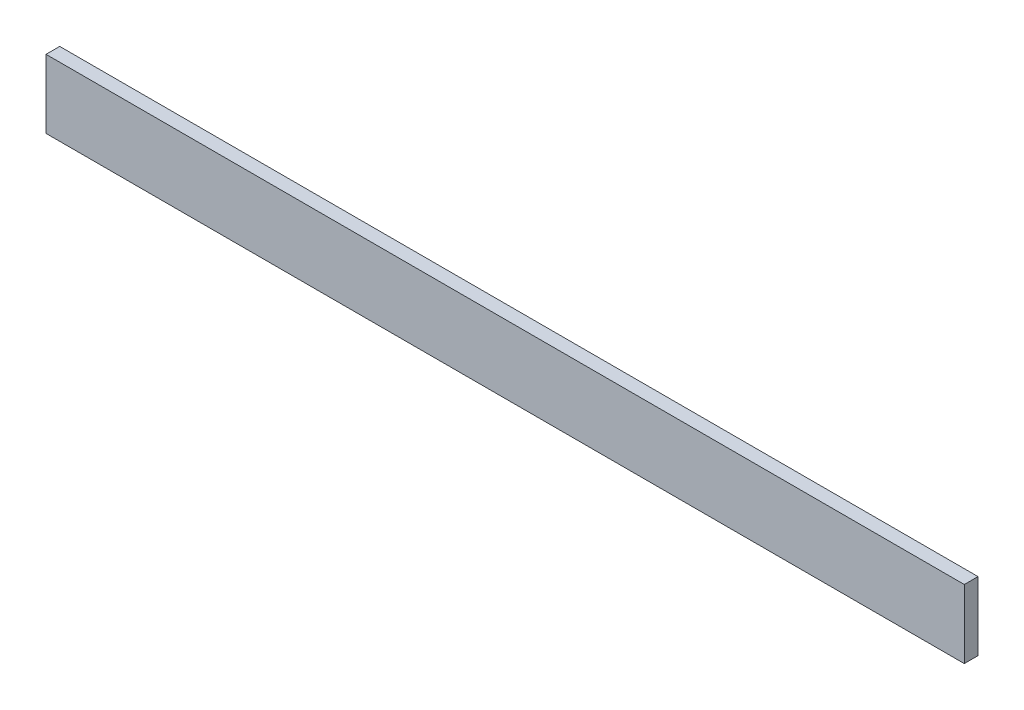
ISO-10303-21;
HEADER;
FILE_DESCRIPTION(('STEP AP214'),'2;1');
FILE_NAME('part.step','',(''),(''),'','','');
FILE_SCHEMA(('AUTOMOTIVE_DESIGN { 1 0 10303 214 1 1 1 1 }'));
ENDSEC;
DATA;
#1=APPLICATION_CONTEXT('core data for automotive mechanical design processes');
#2=APPLICATION_PROTOCOL_DEFINITION('international standard','automotive_design',2000,#1);
#3=PRODUCT_CONTEXT('',#1,'mechanical');
#4=PRODUCT('Part','Part','',(#3));
#5=PRODUCT_RELATED_PRODUCT_CATEGORY('part','',(#4));
#6=PRODUCT_DEFINITION_FORMATION('','',#4);
#7=PRODUCT_DEFINITION_CONTEXT('part definition',#1,'design');
#8=PRODUCT_DEFINITION('design','',#6,#7);
#9=PRODUCT_DEFINITION_SHAPE('','',#8);
#10=(LENGTH_UNIT() NAMED_UNIT(*) SI_UNIT(.MILLI.,.METRE.));
#11=(NAMED_UNIT(*) PLANE_ANGLE_UNIT() SI_UNIT($,.RADIAN.));
#12=(NAMED_UNIT(*) SI_UNIT($,.STERADIAN.) SOLID_ANGLE_UNIT());
#13=UNCERTAINTY_MEASURE_WITH_UNIT(LENGTH_MEASURE(1.E-05),#10,'distance_accuracy_value','');
#14=(GEOMETRIC_REPRESENTATION_CONTEXT(3) GLOBAL_UNCERTAINTY_ASSIGNED_CONTEXT((#13)) GLOBAL_UNIT_ASSIGNED_CONTEXT((#10,
#11,#12)) REPRESENTATION_CONTEXT('',''));
#15=CARTESIAN_POINT('',(0.,0.,0.));
#16=DIRECTION('',(0.,0.,1.));
#17=DIRECTION('',(1.,0.,0.));
#18=AXIS2_PLACEMENT_3D('',#15,#16,#17);
#19=CARTESIAN_POINT('',(0.,0.,12.7));
#20=DIRECTION('',(1.,0.,0.));
#21=DIRECTION('',(0.,0.,-1.));
#22=AXIS2_PLACEMENT_3D('',#19,#20,#21);
#23=PLANE('',#22);
#24=DIRECTION('',(0.,-1.,0.));
#25=VECTOR('',#24,1.);
#26=CARTESIAN_POINT('',(0.,0.,0.));
#27=LINE('',#26,#25);
#28=CARTESIAN_POINT('',(0.,63.5,0.));
#29=VERTEX_POINT('',#28);
#30=CARTESIAN_POINT('',(0.,0.,0.));
#31=VERTEX_POINT('',#30);
#32=EDGE_CURVE('E97',#29,#31,#27,.T.);
#33=ORIENTED_EDGE('',*,*,#32,.T.);
#34=DIRECTION('',(0.,0.,-1.));
#35=VECTOR('',#34,1.);
#36=CARTESIAN_POINT('',(0.,0.,12.7));
#37=LINE('',#36,#35);
#38=CARTESIAN_POINT('',(0.,0.,12.7));
#39=VERTEX_POINT('',#38);
#40=EDGE_CURVE('E11',#39,#31,#37,.T.);
#41=ORIENTED_EDGE('',*,*,#40,.F.);
#42=DIRECTION('',(0.,-1.,0.));
#43=VECTOR('',#42,1.);
#44=CARTESIAN_POINT('',(0.,0.,12.7));
#45=LINE('',#44,#43);
#46=CARTESIAN_POINT('',(0.,63.5,12.7));
#47=VERTEX_POINT('',#46);
#48=EDGE_CURVE('E85',#47,#39,#45,.T.);
#49=ORIENTED_EDGE('',*,*,#48,.F.);
#50=DIRECTION('',(0.,0.,-1.));
#51=VECTOR('',#50,1.);
#52=CARTESIAN_POINT('',(0.,63.5,12.7));
#53=LINE('',#52,#51);
#54=EDGE_CURVE('E93',#47,#29,#53,.T.);
#55=ORIENTED_EDGE('',*,*,#54,.T.);
#56=EDGE_LOOP('',(#33,#41,#49,#55));
#57=FACE_BOUND('',#56,.T.);
#58=ADVANCED_FACE('F34',(#57),#23,.F.);
#59=CARTESIAN_POINT('',(0.,0.,12.7));
#60=DIRECTION('',(0.,1.,0.));
#61=DIRECTION('',(0.,0.,1.));
#62=AXIS2_PLACEMENT_3D('',#59,#60,#61);
#63=PLANE('',#62);
#64=DIRECTION('',(1.,0.,0.));
#65=VECTOR('',#64,1.);
#66=CARTESIAN_POINT('',(0.,0.,0.));
#67=LINE('',#66,#65);
#68=CARTESIAN_POINT('',(850.9,0.,0.));
#69=VERTEX_POINT('',#68);
#70=EDGE_CURVE('E89',#31,#69,#67,.T.);
#71=ORIENTED_EDGE('',*,*,#70,.T.);
#72=DIRECTION('',(0.,0.,-1.));
#73=VECTOR('',#72,1.);
#74=CARTESIAN_POINT('',(850.9,0.,12.7));
#75=LINE('',#74,#73);
#76=CARTESIAN_POINT('',(850.9,0.,12.7));
#77=VERTEX_POINT('',#76);
#78=EDGE_CURVE('E42',#77,#69,#75,.T.);
#79=ORIENTED_EDGE('',*,*,#78,.F.);
#80=DIRECTION('',(1.,0.,0.));
#81=VECTOR('',#80,1.);
#82=CARTESIAN_POINT('',(0.,0.,12.7));
#83=LINE('',#82,#81);
#84=EDGE_CURVE('E80',#39,#77,#83,.T.);
#85=ORIENTED_EDGE('',*,*,#84,.F.);
#86=ORIENTED_EDGE('',*,*,#40,.T.);
#87=EDGE_LOOP('',(#71,#79,#85,#86));
#88=FACE_BOUND('',#87,.T.);
#89=ADVANCED_FACE('F88',(#88),#63,.F.);
#90=CARTESIAN_POINT('',(850.9,0.,12.7));
#91=DIRECTION('',(-1.,0.,0.));
#92=DIRECTION('',(0.,-1.,0.));
#93=AXIS2_PLACEMENT_3D('',#90,#91,#92);
#94=PLANE('',#93);
#95=DIRECTION('',(0.,1.,0.));
#96=VECTOR('',#95,1.);
#97=CARTESIAN_POINT('',(850.9,0.,0.));
#98=LINE('',#97,#96);
#99=CARTESIAN_POINT('',(850.9,63.5,0.));
#100=VERTEX_POINT('',#99);
#101=EDGE_CURVE('E67',#69,#100,#98,.T.);
#102=ORIENTED_EDGE('',*,*,#101,.T.);
#103=DIRECTION('',(0.,0.,-1.));
#104=VECTOR('',#103,1.);
#105=CARTESIAN_POINT('',(850.9,63.5,12.7));
#106=LINE('',#105,#104);
#107=CARTESIAN_POINT('',(850.9,63.5,12.7));
#108=VERTEX_POINT('',#107);
#109=EDGE_CURVE('E90',#108,#100,#106,.T.);
#110=ORIENTED_EDGE('',*,*,#109,.F.);
#111=DIRECTION('',(0.,1.,0.));
#112=VECTOR('',#111,1.);
#113=CARTESIAN_POINT('',(850.9,0.,12.7));
#114=LINE('',#113,#112);
#115=EDGE_CURVE('E83',#77,#108,#114,.T.);
#116=ORIENTED_EDGE('',*,*,#115,.F.);
#117=ORIENTED_EDGE('',*,*,#78,.T.);
#118=EDGE_LOOP('',(#102,#110,#116,#117));
#119=FACE_BOUND('',#118,.T.);
#120=ADVANCED_FACE('F91',(#119),#94,.F.);
#121=CARTESIAN_POINT('',(0.,63.5,12.7));
#122=DIRECTION('',(0.,-1.,0.));
#123=DIRECTION('',(0.,0.,-1.));
#124=AXIS2_PLACEMENT_3D('',#121,#122,#123);
#125=PLANE('',#124);
#126=DIRECTION('',(-1.,0.,0.));
#127=VECTOR('',#126,1.);
#128=CARTESIAN_POINT('',(0.,63.5,0.));
#129=LINE('',#128,#127);
#130=EDGE_CURVE('E73',#100,#29,#129,.T.);
#131=ORIENTED_EDGE('',*,*,#130,.T.);
#132=ORIENTED_EDGE('',*,*,#54,.F.);
#133=DIRECTION('',(-1.,0.,0.));
#134=VECTOR('',#133,1.);
#135=CARTESIAN_POINT('',(0.,63.5,12.7));
#136=LINE('',#135,#134);
#137=EDGE_CURVE('E50',#108,#47,#136,.T.);
#138=ORIENTED_EDGE('',*,*,#137,.F.);
#139=ORIENTED_EDGE('',*,*,#109,.T.);
#140=EDGE_LOOP('',(#131,#132,#138,#139));
#141=FACE_BOUND('',#140,.T.);
#142=ADVANCED_FACE('F104',(#141),#125,.F.);
#143=CARTESIAN_POINT('',(0.,0.,12.7));
#144=DIRECTION('',(0.,0.,-1.));
#145=DIRECTION('',(-1.,0.,0.));
#146=AXIS2_PLACEMENT_3D('',#143,#144,#145);
#147=PLANE('',#146);
#148=ORIENTED_EDGE('',*,*,#48,.T.);
#149=ORIENTED_EDGE('',*,*,#84,.T.);
#150=ORIENTED_EDGE('',*,*,#115,.T.);
#151=ORIENTED_EDGE('',*,*,#137,.T.);
#152=EDGE_LOOP('',(#148,#149,#150,#151));
#153=FACE_BOUND('',#152,.T.);
#154=ADVANCED_FACE('F81',(#153),#147,.F.);
#155=CARTESIAN_POINT('',(0.,0.,0.));
#156=DIRECTION('',(0.,0.,-1.));
#157=DIRECTION('',(-1.,0.,0.));
#158=AXIS2_PLACEMENT_3D('',#155,#156,#157);
#159=PLANE('',#158);
#160=ORIENTED_EDGE('',*,*,#32,.F.);
#161=ORIENTED_EDGE('',*,*,#130,.F.);
#162=ORIENTED_EDGE('',*,*,#101,.F.);
#163=ORIENTED_EDGE('',*,*,#70,.F.);
#164=EDGE_LOOP('',(#160,#161,#162,#163));
#165=FACE_BOUND('',#164,.T.);
#166=ADVANCED_FACE('F107',(#165),#159,.T.);
#167=CLOSED_SHELL('',(#58,#89,#120,#142,#154,#166));
#168=MANIFOLD_SOLID_BREP('B2',#167);
#169=ADVANCED_BREP_SHAPE_REPRESENTATION('',(#18,#168),#14);
#170=SHAPE_DEFINITION_REPRESENTATION(#9,#169);
ENDSEC;
END-ISO-10303-21;
